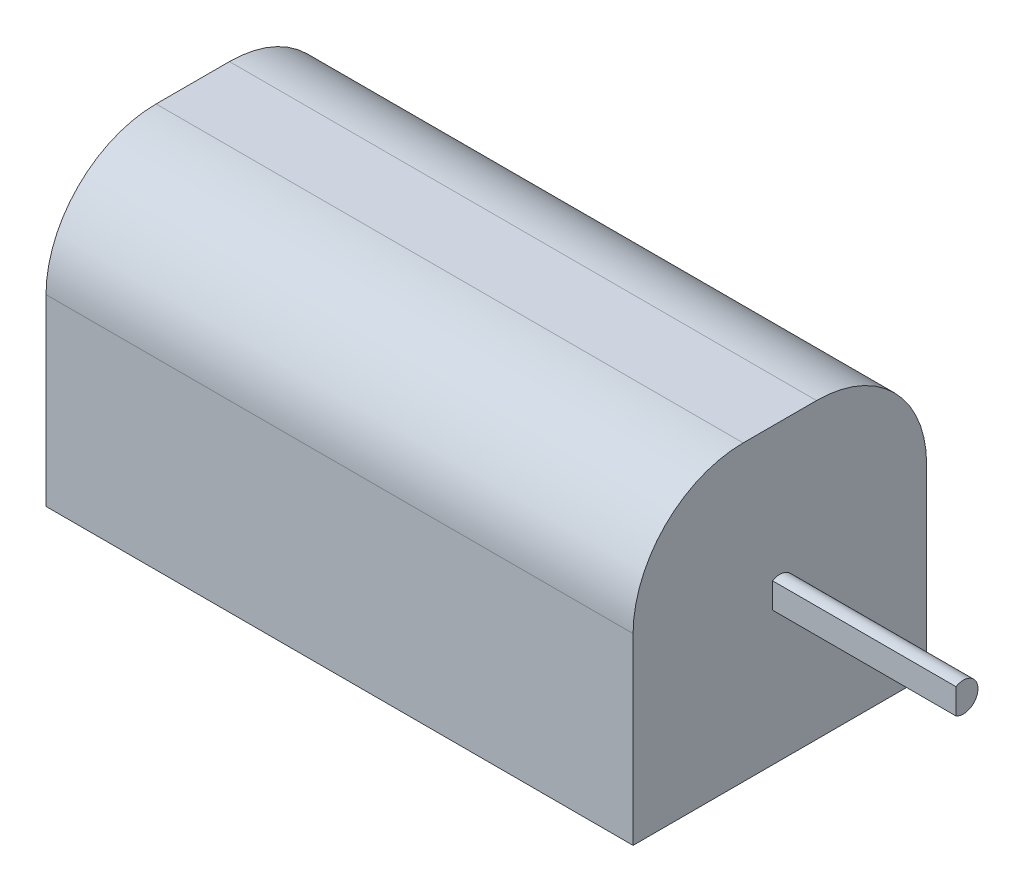
ISO-10303-21;
HEADER;
FILE_DESCRIPTION(('STEP AP214'),'2;1');
FILE_NAME('part.step','',(''),(''),'','','');
FILE_SCHEMA(('AUTOMOTIVE_DESIGN { 1 0 10303 214 1 1 1 1 }'));
ENDSEC;
DATA;
#1=APPLICATION_CONTEXT('core data for automotive mechanical design processes');
#2=APPLICATION_PROTOCOL_DEFINITION('international standard','automotive_design',2000,#1);
#3=PRODUCT_CONTEXT('',#1,'mechanical');
#4=PRODUCT('Part','Part','',(#3));
#5=PRODUCT_RELATED_PRODUCT_CATEGORY('part','',(#4));
#6=PRODUCT_DEFINITION_FORMATION('','',#4);
#7=PRODUCT_DEFINITION_CONTEXT('part definition',#1,'design');
#8=PRODUCT_DEFINITION('design','',#6,#7);
#9=PRODUCT_DEFINITION_SHAPE('','',#8);
#10=(LENGTH_UNIT() NAMED_UNIT(*) SI_UNIT(.MILLI.,.METRE.));
#11=(NAMED_UNIT(*) PLANE_ANGLE_UNIT() SI_UNIT($,.RADIAN.));
#12=(NAMED_UNIT(*) SI_UNIT($,.STERADIAN.) SOLID_ANGLE_UNIT());
#13=UNCERTAINTY_MEASURE_WITH_UNIT(LENGTH_MEASURE(1.E-05),#10,'distance_accuracy_value','');
#14=(GEOMETRIC_REPRESENTATION_CONTEXT(3) GLOBAL_UNCERTAINTY_ASSIGNED_CONTEXT((#13)) GLOBAL_UNIT_ASSIGNED_CONTEXT((#10,
#11,#12)) REPRESENTATION_CONTEXT('',''));
#15=CARTESIAN_POINT('',(0.,0.,0.));
#16=DIRECTION('',(0.,0.,1.));
#17=DIRECTION('',(1.,0.,0.));
#18=AXIS2_PLACEMENT_3D('',#15,#16,#17);
#19=CARTESIAN_POINT('',(40.,20.,20.));
#20=DIRECTION('',(-1.,0.,0.));
#21=DIRECTION('',(0.,0.,1.));
#22=AXIS2_PLACEMENT_3D('',#19,#20,#21);
#23=PLANE('',#22);
#24=DIRECTION('',(0.,-1.,0.));
#25=VECTOR('',#24,1.);
#26=CARTESIAN_POINT('',(40.,20.,1.));
#27=LINE('',#26,#25);
#28=CARTESIAN_POINT('',(40.,1.73205080756888,1.));
#29=VERTEX_POINT('',#28);
#30=CARTESIAN_POINT('',(40.,-1.73205080756888,1.));
#31=VERTEX_POINT('',#30);
#32=EDGE_CURVE('E114',#29,#31,#27,.T.);
#33=ORIENTED_EDGE('',*,*,#32,.F.);
#34=CARTESIAN_POINT('',(40.,0.,0.));
#35=DIRECTION('',(-1.,0.,0.));
#36=DIRECTION('',(0.,0.,1.));
#37=AXIS2_PLACEMENT_3D('',#34,#35,#36);
#38=CIRCLE('',#37,2.);
#39=EDGE_CURVE('E121',#29,#31,#38,.T.);
#40=ORIENTED_EDGE('',*,*,#39,.T.);
#41=EDGE_LOOP('',(#33,#40));
#42=FACE_BOUND('',#41,.T.);
#43=DIRECTION('',(0.,-1.,0.));
#44=VECTOR('',#43,1.);
#45=CARTESIAN_POINT('',(40.,20.,-20.));
#46=LINE('',#45,#44);
#47=CARTESIAN_POINT('',(40.,5.,-20.));
#48=VERTEX_POINT('',#47);
#49=CARTESIAN_POINT('',(40.,-20.,-20.));
#50=VERTEX_POINT('',#49);
#51=EDGE_CURVE('E150',#48,#50,#46,.T.);
#52=ORIENTED_EDGE('',*,*,#51,.F.);
#53=CARTESIAN_POINT('',(40.,5.,-5.));
#54=DIRECTION('',(-1.,0.,0.));
#55=DIRECTION('',(0.,0.,1.));
#56=AXIS2_PLACEMENT_3D('',#53,#54,#55);
#57=CIRCLE('',#56,15.);
#58=CARTESIAN_POINT('',(40.,20.,-5.));
#59=VERTEX_POINT('',#58);
#60=EDGE_CURVE('E45',#48,#59,#57,.F.);
#61=ORIENTED_EDGE('',*,*,#60,.T.);
#62=DIRECTION('',(0.,0.,-1.));
#63=VECTOR('',#62,1.);
#64=CARTESIAN_POINT('',(40.,20.,20.));
#65=LINE('',#64,#63);
#66=CARTESIAN_POINT('',(40.,20.,5.));
#67=VERTEX_POINT('',#66);
#68=EDGE_CURVE('E127',#67,#59,#65,.T.);
#69=ORIENTED_EDGE('',*,*,#68,.F.);
#70=CARTESIAN_POINT('',(40.,5.,5.));
#71=DIRECTION('',(-1.,0.,0.));
#72=DIRECTION('',(0.,0.,1.));
#73=AXIS2_PLACEMENT_3D('',#70,#71,#72);
#74=CIRCLE('',#73,15.);
#75=CARTESIAN_POINT('',(40.,5.,20.));
#76=VERTEX_POINT('',#75);
#77=EDGE_CURVE('E52',#67,#76,#74,.F.);
#78=ORIENTED_EDGE('',*,*,#77,.T.);
#79=DIRECTION('',(0.,-1.,0.));
#80=VECTOR('',#79,1.);
#81=CARTESIAN_POINT('',(40.,20.,20.));
#82=LINE('',#81,#80);
#83=CARTESIAN_POINT('',(40.,-20.,20.));
#84=VERTEX_POINT('',#83);
#85=EDGE_CURVE('E134',#76,#84,#82,.T.);
#86=ORIENTED_EDGE('',*,*,#85,.T.);
#87=DIRECTION('',(0.,0.,-1.));
#88=VECTOR('',#87,1.);
#89=CARTESIAN_POINT('',(40.,-20.,20.));
#90=LINE('',#89,#88);
#91=EDGE_CURVE('E125',#84,#50,#90,.T.);
#92=ORIENTED_EDGE('',*,*,#91,.T.);
#93=EDGE_LOOP('',(#52,#61,#69,#78,#86,#92));
#94=FACE_BOUND('',#93,.T.);
#95=ADVANCED_FACE('F37',(#42,#94),#23,.F.);
#96=CARTESIAN_POINT('',(-40.,20.,-20.));
#97=DIRECTION('',(0.,0.,1.));
#98=DIRECTION('',(1.,0.,0.));
#99=AXIS2_PLACEMENT_3D('',#96,#97,#98);
#100=PLANE('',#99);
#101=DIRECTION('',(0.,-1.,0.));
#102=VECTOR('',#101,1.);
#103=CARTESIAN_POINT('',(-40.,20.,-20.));
#104=LINE('',#103,#102);
#105=CARTESIAN_POINT('',(-40.,5.,-20.));
#106=VERTEX_POINT('',#105);
#107=CARTESIAN_POINT('',(-40.,-20.,-20.));
#108=VERTEX_POINT('',#107);
#109=EDGE_CURVE('E148',#106,#108,#104,.T.);
#110=ORIENTED_EDGE('',*,*,#109,.F.);
#111=DIRECTION('',(-1.,0.,0.));
#112=VECTOR('',#111,1.);
#113=CARTESIAN_POINT('',(-40.,5.,-20.));
#114=LINE('',#113,#112);
#115=EDGE_CURVE('E60',#106,#48,#114,.F.);
#116=ORIENTED_EDGE('',*,*,#115,.T.);
#117=ORIENTED_EDGE('',*,*,#51,.T.);
#118=DIRECTION('',(-1.,0.,0.));
#119=VECTOR('',#118,1.);
#120=CARTESIAN_POINT('',(-40.,-20.,-20.));
#121=LINE('',#120,#119);
#122=EDGE_CURVE('E137',#50,#108,#121,.T.);
#123=ORIENTED_EDGE('',*,*,#122,.T.);
#124=EDGE_LOOP('',(#110,#116,#117,#123));
#125=FACE_BOUND('',#124,.T.);
#126=ADVANCED_FACE('F173',(#125),#100,.F.);
#127=CARTESIAN_POINT('',(-40.,20.,20.));
#128=DIRECTION('',(1.,0.,0.));
#129=DIRECTION('',(0.,0.,-1.));
#130=AXIS2_PLACEMENT_3D('',#127,#128,#129);
#131=PLANE('',#130);
#132=DIRECTION('',(0.,0.,1.));
#133=VECTOR('',#132,1.);
#134=CARTESIAN_POINT('',(-40.,20.,20.));
#135=LINE('',#134,#133);
#136=CARTESIAN_POINT('',(-40.,20.,-5.));
#137=VERTEX_POINT('',#136);
#138=CARTESIAN_POINT('',(-40.,20.,5.));
#139=VERTEX_POINT('',#138);
#140=EDGE_CURVE('E130',#137,#139,#135,.T.);
#141=ORIENTED_EDGE('',*,*,#140,.F.);
#142=CARTESIAN_POINT('',(-40.,5.,-5.));
#143=DIRECTION('',(1.,0.,0.));
#144=DIRECTION('',(0.,0.,-1.));
#145=AXIS2_PLACEMENT_3D('',#142,#143,#144);
#146=CIRCLE('',#145,15.);
#147=EDGE_CURVE('E160',#137,#106,#146,.F.);
#148=ORIENTED_EDGE('',*,*,#147,.T.);
#149=ORIENTED_EDGE('',*,*,#109,.T.);
#150=DIRECTION('',(0.,0.,1.));
#151=VECTOR('',#150,1.);
#152=CARTESIAN_POINT('',(-40.,-20.,20.));
#153=LINE('',#152,#151);
#154=CARTESIAN_POINT('',(-40.,-20.,20.));
#155=VERTEX_POINT('',#154);
#156=EDGE_CURVE('E140',#108,#155,#153,.T.);
#157=ORIENTED_EDGE('',*,*,#156,.T.);
#158=DIRECTION('',(0.,-1.,0.));
#159=VECTOR('',#158,1.);
#160=CARTESIAN_POINT('',(-40.,20.,20.));
#161=LINE('',#160,#159);
#162=CARTESIAN_POINT('',(-40.,5.,20.));
#163=VERTEX_POINT('',#162);
#164=EDGE_CURVE('E146',#163,#155,#161,.T.);
#165=ORIENTED_EDGE('',*,*,#164,.F.);
#166=CARTESIAN_POINT('',(-40.,5.,5.));
#167=DIRECTION('',(1.,0.,0.));
#168=DIRECTION('',(0.,0.,-1.));
#169=AXIS2_PLACEMENT_3D('',#166,#167,#168);
#170=CIRCLE('',#169,15.);
#171=EDGE_CURVE('E158',#163,#139,#170,.F.);
#172=ORIENTED_EDGE('',*,*,#171,.T.);
#173=EDGE_LOOP('',(#141,#148,#149,#157,#165,#172));
#174=FACE_BOUND('',#173,.T.);
#175=ADVANCED_FACE('F172',(#174),#131,.F.);
#176=CARTESIAN_POINT('',(-40.,20.,20.));
#177=DIRECTION('',(0.,0.,-1.));
#178=DIRECTION('',(-1.,0.,0.));
#179=AXIS2_PLACEMENT_3D('',#176,#177,#178);
#180=PLANE('',#179);
#181=ORIENTED_EDGE('',*,*,#85,.F.);
#182=DIRECTION('',(1.,0.,0.));
#183=VECTOR('',#182,1.);
#184=CARTESIAN_POINT('',(-40.,5.,20.));
#185=LINE('',#184,#183);
#186=EDGE_CURVE('E11',#76,#163,#185,.F.);
#187=ORIENTED_EDGE('',*,*,#186,.T.);
#188=ORIENTED_EDGE('',*,*,#164,.T.);
#189=DIRECTION('',(1.,0.,0.));
#190=VECTOR('',#189,1.);
#191=CARTESIAN_POINT('',(-40.,-20.,20.));
#192=LINE('',#191,#190);
#193=EDGE_CURVE('E131',#155,#84,#192,.T.);
#194=ORIENTED_EDGE('',*,*,#193,.T.);
#195=EDGE_LOOP('',(#181,#187,#188,#194));
#196=FACE_BOUND('',#195,.T.);
#197=ADVANCED_FACE('F185',(#196),#180,.F.);
#198=CARTESIAN_POINT('',(0.,20.,0.));
#199=DIRECTION('',(0.,-1.,0.));
#200=DIRECTION('',(0.,0.,-1.));
#201=AXIS2_PLACEMENT_3D('',#198,#199,#200);
#202=PLANE('',#201);
#203=ORIENTED_EDGE('',*,*,#68,.T.);
#204=DIRECTION('',(-1.,0.,0.));
#205=VECTOR('',#204,1.);
#206=CARTESIAN_POINT('',(0.,20.,-5.));
#207=LINE('',#206,#205);
#208=EDGE_CURVE('E155',#59,#137,#207,.T.);
#209=ORIENTED_EDGE('',*,*,#208,.T.);
#210=ORIENTED_EDGE('',*,*,#140,.T.);
#211=DIRECTION('',(1.,0.,0.));
#212=VECTOR('',#211,1.);
#213=CARTESIAN_POINT('',(0.,20.,5.));
#214=LINE('',#213,#212);
#215=EDGE_CURVE('E152',#139,#67,#214,.T.);
#216=ORIENTED_EDGE('',*,*,#215,.T.);
#217=EDGE_LOOP('',(#203,#209,#210,#216));
#218=FACE_BOUND('',#217,.T.);
#219=ADVANCED_FACE('F167',(#218),#202,.F.);
#220=CARTESIAN_POINT('',(0.,-20.,0.));
#221=DIRECTION('',(0.,-1.,0.));
#222=DIRECTION('',(0.,0.,-1.));
#223=AXIS2_PLACEMENT_3D('',#220,#221,#222);
#224=PLANE('',#223);
#225=ORIENTED_EDGE('',*,*,#91,.F.);
#226=ORIENTED_EDGE('',*,*,#193,.F.);
#227=ORIENTED_EDGE('',*,*,#156,.F.);
#228=ORIENTED_EDGE('',*,*,#122,.F.);
#229=EDGE_LOOP('',(#225,#226,#227,#228));
#230=FACE_BOUND('',#229,.T.);
#231=ADVANCED_FACE('F179',(#230),#224,.T.);
#232=CARTESIAN_POINT('',(65.,0.,0.));
#233=DIRECTION('',(-1.,0.,0.));
#234=DIRECTION('',(0.,0.,1.));
#235=AXIS2_PLACEMENT_3D('',#232,#233,#234);
#236=CYLINDRICAL_SURFACE('',#235,2.);
#237=ORIENTED_EDGE('',*,*,#39,.F.);
#238=DIRECTION('',(-1.,0.,0.));
#239=VECTOR('',#238,1.);
#240=CARTESIAN_POINT('',(65.,1.73205080756888,1.));
#241=LINE('',#240,#239);
#242=CARTESIAN_POINT('',(65.,1.73205080756888,1.));
#243=VERTEX_POINT('',#242);
#244=EDGE_CURVE('E117',#243,#29,#241,.T.);
#245=ORIENTED_EDGE('',*,*,#244,.F.);
#246=CARTESIAN_POINT('',(65.,0.,0.));
#247=DIRECTION('',(-1.,0.,0.));
#248=DIRECTION('',(0.,0.,1.));
#249=AXIS2_PLACEMENT_3D('',#246,#247,#248);
#250=CIRCLE('',#249,2.);
#251=CARTESIAN_POINT('',(65.,-1.73205080756888,1.));
#252=VERTEX_POINT('',#251);
#253=EDGE_CURVE('E106',#243,#252,#250,.T.);
#254=ORIENTED_EDGE('',*,*,#253,.T.);
#255=DIRECTION('',(-1.,0.,0.));
#256=VECTOR('',#255,1.);
#257=CARTESIAN_POINT('',(65.,-1.73205080756888,1.));
#258=LINE('',#257,#256);
#259=EDGE_CURVE('E109',#252,#31,#258,.T.);
#260=ORIENTED_EDGE('',*,*,#259,.T.);
#261=EDGE_LOOP('',(#237,#245,#254,#260));
#262=FACE_BOUND('',#261,.T.);
#263=ADVANCED_FACE('F119',(#262),#236,.T.);
#264=CARTESIAN_POINT('',(65.,20.,1.));
#265=DIRECTION('',(0.,0.,-1.));
#266=DIRECTION('',(-1.,0.,0.));
#267=AXIS2_PLACEMENT_3D('',#264,#265,#266);
#268=PLANE('',#267);
#269=ORIENTED_EDGE('',*,*,#32,.T.);
#270=ORIENTED_EDGE('',*,*,#259,.F.);
#271=DIRECTION('',(0.,-1.,0.));
#272=VECTOR('',#271,1.);
#273=CARTESIAN_POINT('',(65.,20.,1.));
#274=LINE('',#273,#272);
#275=EDGE_CURVE('E102',#243,#252,#274,.T.);
#276=ORIENTED_EDGE('',*,*,#275,.F.);
#277=ORIENTED_EDGE('',*,*,#244,.T.);
#278=EDGE_LOOP('',(#269,#270,#276,#277));
#279=FACE_BOUND('',#278,.T.);
#280=ADVANCED_FACE('F113',(#279),#268,.F.);
#281=CARTESIAN_POINT('',(65.,0.,0.));
#282=DIRECTION('',(-1.,0.,0.));
#283=DIRECTION('',(0.,0.,1.));
#284=AXIS2_PLACEMENT_3D('',#281,#282,#283);
#285=PLANE('',#284);
#286=ORIENTED_EDGE('',*,*,#253,.F.);
#287=ORIENTED_EDGE('',*,*,#275,.T.);
#288=EDGE_LOOP('',(#286,#287));
#289=FACE_BOUND('',#288,.T.);
#290=ADVANCED_FACE('F104',(#289),#285,.F.);
#291=CARTESIAN_POINT('',(0.,5.,-5.));
#292=DIRECTION('',(-1.,0.,0.));
#293=DIRECTION('',(0.,0.,1.));
#294=AXIS2_PLACEMENT_3D('',#291,#292,#293);
#295=CYLINDRICAL_SURFACE('',#294,15.);
#296=ORIENTED_EDGE('',*,*,#60,.F.);
#297=ORIENTED_EDGE('',*,*,#115,.F.);
#298=ORIENTED_EDGE('',*,*,#147,.F.);
#299=ORIENTED_EDGE('',*,*,#208,.F.);
#300=EDGE_LOOP('',(#296,#297,#298,#299));
#301=FACE_BOUND('',#300,.T.);
#302=ADVANCED_FACE('F170',(#301),#295,.T.);
#303=CARTESIAN_POINT('',(0.,5.,5.));
#304=DIRECTION('',(1.,0.,0.));
#305=DIRECTION('',(0.,0.,-1.));
#306=AXIS2_PLACEMENT_3D('',#303,#304,#305);
#307=CYLINDRICAL_SURFACE('',#306,15.);
#308=ORIENTED_EDGE('',*,*,#171,.F.);
#309=ORIENTED_EDGE('',*,*,#186,.F.);
#310=ORIENTED_EDGE('',*,*,#77,.F.);
#311=ORIENTED_EDGE('',*,*,#215,.F.);
#312=EDGE_LOOP('',(#308,#309,#310,#311));
#313=FACE_BOUND('',#312,.T.);
#314=ADVANCED_FACE('F39',(#313),#307,.T.);
#315=CLOSED_SHELL('',(#95,#126,#175,#197,#219,#231,#263,#280,#290,#302,#314));
#316=MANIFOLD_SOLID_BREP('B2',#315);
#317=ADVANCED_BREP_SHAPE_REPRESENTATION('',(#18,#316),#14);
#318=SHAPE_DEFINITION_REPRESENTATION(#9,#317);
ENDSEC;
END-ISO-10303-21;
